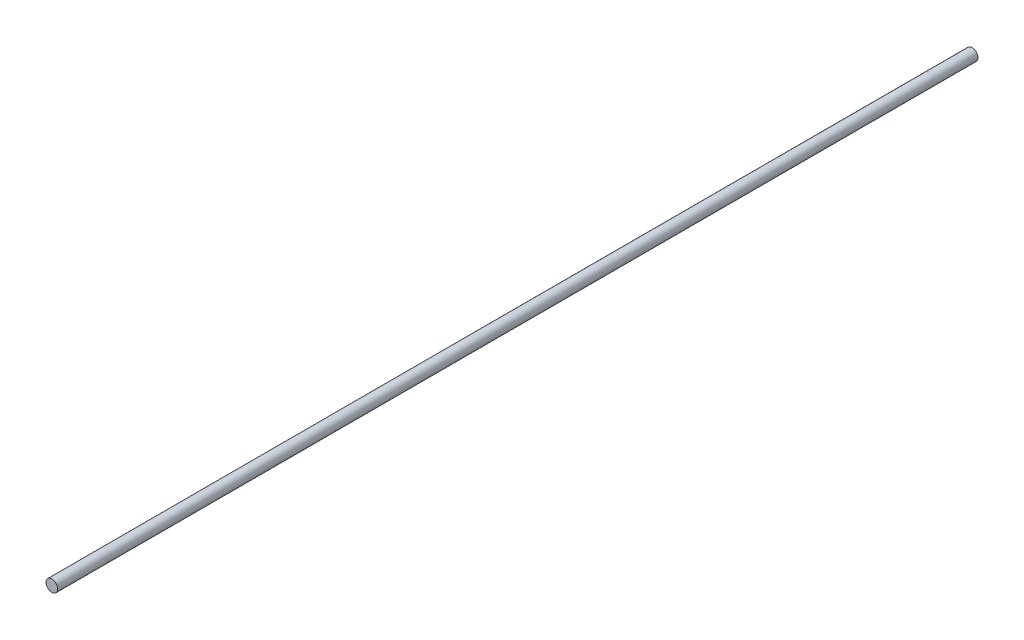
ISO-10303-21;
HEADER;
FILE_DESCRIPTION(('STEP AP214'),'2;1');
FILE_NAME('part.step','',(''),(''),'','','');
FILE_SCHEMA(('AUTOMOTIVE_DESIGN { 1 0 10303 214 1 1 1 1 }'));
ENDSEC;
DATA;
#1=APPLICATION_CONTEXT('core data for automotive mechanical design processes');
#2=APPLICATION_PROTOCOL_DEFINITION('international standard','automotive_design',2000,#1);
#3=PRODUCT_CONTEXT('',#1,'mechanical');
#4=PRODUCT('Part','Part','',(#3));
#5=PRODUCT_RELATED_PRODUCT_CATEGORY('part','',(#4));
#6=PRODUCT_DEFINITION_FORMATION('','',#4);
#7=PRODUCT_DEFINITION_CONTEXT('part definition',#1,'design');
#8=PRODUCT_DEFINITION('design','',#6,#7);
#9=PRODUCT_DEFINITION_SHAPE('','',#8);
#10=(LENGTH_UNIT() NAMED_UNIT(*) SI_UNIT(.MILLI.,.METRE.));
#11=(NAMED_UNIT(*) PLANE_ANGLE_UNIT() SI_UNIT($,.RADIAN.));
#12=(NAMED_UNIT(*) SI_UNIT($,.STERADIAN.) SOLID_ANGLE_UNIT());
#13=UNCERTAINTY_MEASURE_WITH_UNIT(LENGTH_MEASURE(1.E-05),#10,'distance_accuracy_value','');
#14=(GEOMETRIC_REPRESENTATION_CONTEXT(3) GLOBAL_UNCERTAINTY_ASSIGNED_CONTEXT((#13)) GLOBAL_UNIT_ASSIGNED_CONTEXT((#10,
#11,#12)) REPRESENTATION_CONTEXT('',''));
#15=CARTESIAN_POINT('',(0.,0.,0.));
#16=DIRECTION('',(0.,0.,1.));
#17=DIRECTION('',(1.,0.,0.));
#18=AXIS2_PLACEMENT_3D('',#15,#16,#17);
#19=CARTESIAN_POINT('',(0.,0.,630.));
#20=DIRECTION('',(0.,0.,-1.));
#21=DIRECTION('',(-1.,0.,0.));
#22=AXIS2_PLACEMENT_3D('',#19,#20,#21);
#23=CYLINDRICAL_SURFACE('',#22,4.);
#24=CARTESIAN_POINT('',(0.,0.,630.));
#25=DIRECTION('',(0.,0.,1.));
#26=DIRECTION('',(1.,0.,0.));
#27=AXIS2_PLACEMENT_3D('',#24,#25,#26);
#28=CIRCLE('',#27,4.);
#29=CARTESIAN_POINT('',(4.,0.,630.));
#30=VERTEX_POINT('',#29);
#31=EDGE_CURVE('E10',#30,#30,#28,.T.);
#32=ORIENTED_EDGE('',*,*,#31,.F.);
#33=EDGE_LOOP('',(#32));
#34=FACE_BOUND('',#33,.T.);
#35=CARTESIAN_POINT('',(0.,0.,0.));
#36=DIRECTION('',(0.,0.,1.));
#37=DIRECTION('',(1.,0.,0.));
#38=AXIS2_PLACEMENT_3D('',#35,#36,#37);
#39=CIRCLE('',#38,4.);
#40=CARTESIAN_POINT('',(4.,0.,0.));
#41=VERTEX_POINT('',#40);
#42=EDGE_CURVE('E40',#41,#41,#39,.T.);
#43=ORIENTED_EDGE('',*,*,#42,.T.);
#44=EDGE_LOOP('',(#43));
#45=FACE_BOUND('',#44,.T.);
#46=ADVANCED_FACE('F37',(#34,#45),#23,.T.);
#47=CARTESIAN_POINT('',(0.,0.,630.));
#48=DIRECTION('',(0.,0.,1.));
#49=DIRECTION('',(1.,0.,0.));
#50=AXIS2_PLACEMENT_3D('',#47,#48,#49);
#51=PLANE('',#50);
#52=ORIENTED_EDGE('',*,*,#31,.T.);
#53=EDGE_LOOP('',(#52));
#54=FACE_BOUND('',#53,.T.);
#55=ADVANCED_FACE('F54',(#54),#51,.T.);
#56=CARTESIAN_POINT('',(0.,0.,0.));
#57=DIRECTION('',(0.,0.,1.));
#58=DIRECTION('',(1.,0.,0.));
#59=AXIS2_PLACEMENT_3D('',#56,#57,#58);
#60=PLANE('',#59);
#61=ORIENTED_EDGE('',*,*,#42,.F.);
#62=EDGE_LOOP('',(#61));
#63=FACE_BOUND('',#62,.T.);
#64=ADVANCED_FACE('F52',(#63),#60,.F.);
#65=CLOSED_SHELL('',(#46,#55,#64));
#66=MANIFOLD_SOLID_BREP('B2',#65);
#67=ADVANCED_BREP_SHAPE_REPRESENTATION('',(#18,#66),#14);
#68=SHAPE_DEFINITION_REPRESENTATION(#9,#67);
ENDSEC;
END-ISO-10303-21;
